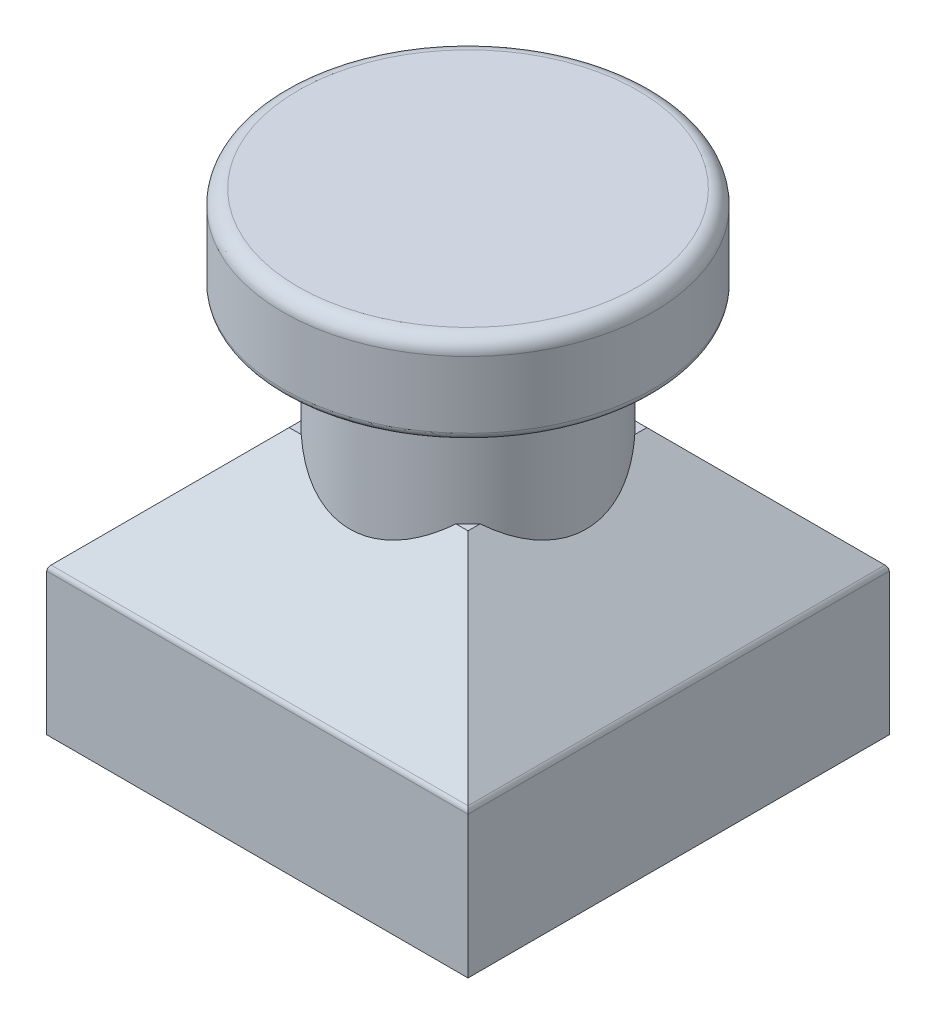
ISO-10303-21;
HEADER;
FILE_DESCRIPTION(('STEP AP214'),'2;1');
FILE_NAME('part.step','',(''),(''),'','','');
FILE_SCHEMA(('AUTOMOTIVE_DESIGN { 1 0 10303 214 1 1 1 1 }'));
ENDSEC;
DATA;
#1=APPLICATION_CONTEXT('core data for automotive mechanical design processes');
#2=APPLICATION_PROTOCOL_DEFINITION('international standard','automotive_design',2000,#1);
#3=PRODUCT_CONTEXT('',#1,'mechanical');
#4=PRODUCT('Part','Part','',(#3));
#5=PRODUCT_RELATED_PRODUCT_CATEGORY('part','',(#4));
#6=PRODUCT_DEFINITION_FORMATION('','',#4);
#7=PRODUCT_DEFINITION_CONTEXT('part definition',#1,'design');
#8=PRODUCT_DEFINITION('design','',#6,#7);
#9=PRODUCT_DEFINITION_SHAPE('','',#8);
#10=(LENGTH_UNIT() NAMED_UNIT(*) SI_UNIT(.MILLI.,.METRE.));
#11=(NAMED_UNIT(*) PLANE_ANGLE_UNIT() SI_UNIT($,.RADIAN.));
#12=(NAMED_UNIT(*) SI_UNIT($,.STERADIAN.) SOLID_ANGLE_UNIT());
#13=UNCERTAINTY_MEASURE_WITH_UNIT(LENGTH_MEASURE(1.E-05),#10,'distance_accuracy_value','');
#14=(GEOMETRIC_REPRESENTATION_CONTEXT(3) GLOBAL_UNCERTAINTY_ASSIGNED_CONTEXT((#13)) GLOBAL_UNIT_ASSIGNED_CONTEXT((#10,
#11,#12)) REPRESENTATION_CONTEXT('',''));
#15=CARTESIAN_POINT('',(0.,0.,0.));
#16=DIRECTION('',(0.,0.,1.));
#17=DIRECTION('',(1.,0.,0.));
#18=AXIS2_PLACEMENT_3D('',#15,#16,#17);
#19=CARTESIAN_POINT('',(0.,9.,0.));
#20=DIRECTION('',(0.,1.,0.));
#21=DIRECTION('',(0.,0.,1.));
#22=AXIS2_PLACEMENT_3D('',#19,#20,#21);
#23=PLANE('',#22);
#24=DIRECTION('',(-1.,0.,0.));
#25=VECTOR('',#24,1.);
#26=CARTESIAN_POINT('',(-7.125,9.,-3.02499999999993));
#27=LINE('',#26,#25);
#28=CARTESIAN_POINT('',(-2.61713106282441,9.,-3.02499999999993));
#29=VERTEX_POINT('',#28);
#30=CARTESIAN_POINT('',(-3.02499999999993,9.,-3.02499999999993));
#31=VERTEX_POINT('',#30);
#32=EDGE_CURVE('E198',#29,#31,#27,.T.);
#33=ORIENTED_EDGE('',*,*,#32,.T.);
#34=DIRECTION('',(0.,0.,1.));
#35=VECTOR('',#34,1.);
#36=CARTESIAN_POINT('',(-3.02499999999993,9.,7.125));
#37=LINE('',#36,#35);
#38=CARTESIAN_POINT('',(-3.02499999999993,9.,-2.61713106282441));
#39=VERTEX_POINT('',#38);
#40=EDGE_CURVE('E201',#31,#39,#37,.T.);
#41=ORIENTED_EDGE('',*,*,#40,.T.);
#42=CARTESIAN_POINT('',(0.,9.,0.));
#43=DIRECTION('',(0.,-1.,0.));
#44=DIRECTION('',(0.,0.,-1.));
#45=AXIS2_PLACEMENT_3D('',#42,#43,#44);
#46=CIRCLE('',#45,4.);
#47=EDGE_CURVE('E232',#39,#29,#46,.T.);
#48=ORIENTED_EDGE('',*,*,#47,.T.);
#49=EDGE_LOOP('',(#33,#41,#48));
#50=FACE_BOUND('',#49,.T.);
#51=ADVANCED_FACE('F39',(#50),#23,.T.);
#52=DIRECTION('',(0.,0.,-1.));
#53=VECTOR('',#52,1.);
#54=CARTESIAN_POINT('',(3.02499999999993,9.,-7.125));
#55=LINE('',#54,#53);
#56=CARTESIAN_POINT('',(3.02499999999993,9.,-2.61713106282441));
#57=VERTEX_POINT('',#56);
#58=CARTESIAN_POINT('',(3.02499999999993,9.,-3.02499999999993));
#59=VERTEX_POINT('',#58);
#60=EDGE_CURVE('E192',#57,#59,#55,.T.);
#61=ORIENTED_EDGE('',*,*,#60,.T.);
#62=DIRECTION('',(-1.,0.,0.));
#63=VECTOR('',#62,1.);
#64=CARTESIAN_POINT('',(-7.125,9.,-3.02499999999993));
#65=LINE('',#64,#63);
#66=CARTESIAN_POINT('',(2.61713106282441,9.,-3.02499999999993));
#67=VERTEX_POINT('',#66);
#68=EDGE_CURVE('E195',#59,#67,#65,.T.);
#69=ORIENTED_EDGE('',*,*,#68,.T.);
#70=EDGE_CURVE('E163',#67,#57,#46,.T.);
#71=ORIENTED_EDGE('',*,*,#70,.T.);
#72=EDGE_LOOP('',(#61,#69,#71));
#73=FACE_BOUND('',#72,.T.);
#74=ADVANCED_FACE('F292',(#73),#23,.T.);
#75=CARTESIAN_POINT('',(-2.61713106282441,9.,3.02499999999993));
#76=VERTEX_POINT('',#75);
#77=CARTESIAN_POINT('',(-3.02499999999993,9.,2.61713106282441));
#78=VERTEX_POINT('',#77);
#79=EDGE_CURVE('E321',#76,#78,#46,.T.);
#80=ORIENTED_EDGE('',*,*,#79,.T.);
#81=DIRECTION('',(0.,0.,1.));
#82=VECTOR('',#81,1.);
#83=CARTESIAN_POINT('',(-3.02499999999993,9.,7.125));
#84=LINE('',#83,#82);
#85=CARTESIAN_POINT('',(-3.02499999999993,9.,3.02499999999993));
#86=VERTEX_POINT('',#85);
#87=EDGE_CURVE('E188',#78,#86,#84,.T.);
#88=ORIENTED_EDGE('',*,*,#87,.T.);
#89=DIRECTION('',(1.,0.,0.));
#90=VECTOR('',#89,1.);
#91=CARTESIAN_POINT('',(7.125,9.,3.02499999999993));
#92=LINE('',#91,#90);
#93=EDGE_CURVE('E185',#86,#76,#92,.T.);
#94=ORIENTED_EDGE('',*,*,#93,.T.);
#95=EDGE_LOOP('',(#80,#88,#94));
#96=FACE_BOUND('',#95,.T.);
#97=ADVANCED_FACE('F299',(#96),#23,.T.);
#98=CARTESIAN_POINT('',(7.125,16.,-7.125));
#99=DIRECTION('',(-1.,0.,0.));
#100=DIRECTION('',(0.,0.,1.));
#101=AXIS2_PLACEMENT_3D('',#98,#99,#100);
#102=PLANE('',#101);
#103=DIRECTION('',(0.,-1.,0.));
#104=VECTOR('',#103,1.);
#105=CARTESIAN_POINT('',(7.125,16.,-7.125));
#106=LINE('',#105,#104);
#107=CARTESIAN_POINT('',(7.125,4.7964466094067,-7.125));
#108=VERTEX_POINT('',#107);
#109=CARTESIAN_POINT('',(7.125,0.,-7.125));
#110=VERTEX_POINT('',#109);
#111=EDGE_CURVE('E132',#108,#110,#106,.T.);
#112=ORIENTED_EDGE('',*,*,#111,.F.);
#113=DIRECTION('',(0.,0.,1.));
#114=VECTOR('',#113,1.);
#115=CARTESIAN_POINT('',(7.125,4.7964466094067,7.125));
#116=LINE('',#115,#114);
#117=CARTESIAN_POINT('',(7.125,4.7964466094067,7.125));
#118=VERTEX_POINT('',#117);
#119=EDGE_CURVE('E246',#108,#118,#116,.T.);
#120=ORIENTED_EDGE('',*,*,#119,.T.);
#121=DIRECTION('',(0.,-1.,0.));
#122=VECTOR('',#121,1.);
#123=CARTESIAN_POINT('',(7.125,16.,7.125));
#124=LINE('',#123,#122);
#125=CARTESIAN_POINT('',(7.125,0.,7.125));
#126=VERTEX_POINT('',#125);
#127=EDGE_CURVE('E156',#118,#126,#124,.T.);
#128=ORIENTED_EDGE('',*,*,#127,.T.);
#129=DIRECTION('',(0.,0.,-1.));
#130=VECTOR('',#129,1.);
#131=CARTESIAN_POINT('',(7.125,0.,-7.125));
#132=LINE('',#131,#130);
#133=EDGE_CURVE('E150',#126,#110,#132,.T.);
#134=ORIENTED_EDGE('',*,*,#133,.T.);
#135=EDGE_LOOP('',(#112,#120,#128,#134));
#136=FACE_BOUND('',#135,.T.);
#137=ADVANCED_FACE('F155',(#136),#102,.F.);
#138=CARTESIAN_POINT('',(-7.125,16.,-7.125));
#139=DIRECTION('',(0.,0.,1.));
#140=DIRECTION('',(1.,0.,0.));
#141=AXIS2_PLACEMENT_3D('',#138,#139,#140);
#142=PLANE('',#141);
#143=DIRECTION('',(0.,-1.,0.));
#144=VECTOR('',#143,1.);
#145=CARTESIAN_POINT('',(-7.125,16.,-7.125));
#146=LINE('',#145,#144);
#147=CARTESIAN_POINT('',(-7.125,4.7964466094067,-7.125));
#148=VERTEX_POINT('',#147);
#149=CARTESIAN_POINT('',(-7.125,0.,-7.125));
#150=VERTEX_POINT('',#149);
#151=EDGE_CURVE('E144',#148,#150,#146,.T.);
#152=ORIENTED_EDGE('',*,*,#151,.F.);
#153=DIRECTION('',(1.,0.,0.));
#154=VECTOR('',#153,1.);
#155=CARTESIAN_POINT('',(7.125,4.7964466094067,-7.125));
#156=LINE('',#155,#154);
#157=EDGE_CURVE('E139',#148,#108,#156,.T.);
#158=ORIENTED_EDGE('',*,*,#157,.T.);
#159=ORIENTED_EDGE('',*,*,#111,.T.);
#160=DIRECTION('',(-1.,0.,0.));
#161=VECTOR('',#160,1.);
#162=CARTESIAN_POINT('',(-7.125,0.,-7.125));
#163=LINE('',#162,#161);
#164=EDGE_CURVE('E136',#110,#150,#163,.T.);
#165=ORIENTED_EDGE('',*,*,#164,.T.);
#166=EDGE_LOOP('',(#152,#158,#159,#165));
#167=FACE_BOUND('',#166,.T.);
#168=ADVANCED_FACE('F135',(#167),#142,.F.);
#169=CARTESIAN_POINT('',(-7.125,16.,-7.125));
#170=DIRECTION('',(1.,0.,0.));
#171=DIRECTION('',(0.,0.,-1.));
#172=AXIS2_PLACEMENT_3D('',#169,#170,#171);
#173=PLANE('',#172);
#174=DIRECTION('',(0.,-1.,0.));
#175=VECTOR('',#174,1.);
#176=CARTESIAN_POINT('',(-7.125,16.,7.125));
#177=LINE('',#176,#175);
#178=CARTESIAN_POINT('',(-7.125,4.7964466094067,7.125));
#179=VERTEX_POINT('',#178);
#180=CARTESIAN_POINT('',(-7.125,0.,7.125));
#181=VERTEX_POINT('',#180);
#182=EDGE_CURVE('E174',#179,#181,#177,.T.);
#183=ORIENTED_EDGE('',*,*,#182,.F.);
#184=DIRECTION('',(0.,0.,-1.));
#185=VECTOR('',#184,1.);
#186=CARTESIAN_POINT('',(-7.125,4.7964466094067,-7.125));
#187=LINE('',#186,#185);
#188=EDGE_CURVE('E257',#179,#148,#187,.T.);
#189=ORIENTED_EDGE('',*,*,#188,.T.);
#190=ORIENTED_EDGE('',*,*,#151,.T.);
#191=DIRECTION('',(0.,0.,1.));
#192=VECTOR('',#191,1.);
#193=CARTESIAN_POINT('',(-7.125,0.,-7.125));
#194=LINE('',#193,#192);
#195=EDGE_CURVE('E152',#150,#181,#194,.T.);
#196=ORIENTED_EDGE('',*,*,#195,.T.);
#197=EDGE_LOOP('',(#183,#189,#190,#196));
#198=FACE_BOUND('',#197,.T.);
#199=ADVANCED_FACE('F344',(#198),#173,.F.);
#200=CARTESIAN_POINT('',(-7.125,16.,7.125));
#201=DIRECTION('',(0.,0.,-1.));
#202=DIRECTION('',(-1.,0.,0.));
#203=AXIS2_PLACEMENT_3D('',#200,#201,#202);
#204=PLANE('',#203);
#205=ORIENTED_EDGE('',*,*,#127,.F.);
#206=DIRECTION('',(-1.,0.,0.));
#207=VECTOR('',#206,1.);
#208=CARTESIAN_POINT('',(-7.125,4.7964466094067,7.125));
#209=LINE('',#208,#207);
#210=EDGE_CURVE('E63',#118,#179,#209,.T.);
#211=ORIENTED_EDGE('',*,*,#210,.T.);
#212=ORIENTED_EDGE('',*,*,#182,.T.);
#213=DIRECTION('',(1.,0.,0.));
#214=VECTOR('',#213,1.);
#215=CARTESIAN_POINT('',(-7.125,0.,7.125));
#216=LINE('',#215,#214);
#217=EDGE_CURVE('E169',#181,#126,#216,.T.);
#218=ORIENTED_EDGE('',*,*,#217,.T.);
#219=EDGE_LOOP('',(#205,#211,#212,#218));
#220=FACE_BOUND('',#219,.T.);
#221=ADVANCED_FACE('F311',(#220),#204,.F.);
#222=CARTESIAN_POINT('',(0.,0.,0.));
#223=DIRECTION('',(0.,1.,0.));
#224=DIRECTION('',(0.,0.,1.));
#225=AXIS2_PLACEMENT_3D('',#222,#223,#224);
#226=PLANE('',#225);
#227=ORIENTED_EDGE('',*,*,#133,.F.);
#228=ORIENTED_EDGE('',*,*,#217,.F.);
#229=ORIENTED_EDGE('',*,*,#195,.F.);
#230=ORIENTED_EDGE('',*,*,#164,.F.);
#231=EDGE_LOOP('',(#227,#228,#229,#230));
#232=FACE_BOUND('',#231,.T.);
#233=ADVANCED_FACE('F148',(#232),#226,.F.);
#234=DIRECTION('',(1.,0.,0.));
#235=VECTOR('',#234,1.);
#236=CARTESIAN_POINT('',(7.125,9.,3.02499999999993));
#237=LINE('',#236,#235);
#238=CARTESIAN_POINT('',(2.61713106282441,9.,3.02499999999993));
#239=VERTEX_POINT('',#238);
#240=CARTESIAN_POINT('',(3.02499999999993,9.,3.02499999999993));
#241=VERTEX_POINT('',#240);
#242=EDGE_CURVE('E143',#239,#241,#237,.T.);
#243=ORIENTED_EDGE('',*,*,#242,.T.);
#244=DIRECTION('',(0.,0.,-1.));
#245=VECTOR('',#244,1.);
#246=CARTESIAN_POINT('',(3.02499999999993,9.,-7.125));
#247=LINE('',#246,#245);
#248=CARTESIAN_POINT('',(3.02499999999993,9.,2.61713106282441));
#249=VERTEX_POINT('',#248);
#250=EDGE_CURVE('E182',#241,#249,#247,.T.);
#251=ORIENTED_EDGE('',*,*,#250,.T.);
#252=EDGE_CURVE('E327',#249,#239,#46,.T.);
#253=ORIENTED_EDGE('',*,*,#252,.T.);
#254=EDGE_LOOP('',(#243,#251,#253));
#255=FACE_BOUND('',#254,.T.);
#256=ADVANCED_FACE('F295',(#255),#23,.T.);
#257=CARTESIAN_POINT('',(0.,0.,0.));
#258=DIRECTION('',(0.,-1.,0.));
#259=DIRECTION('',(0.,0.,-1.));
#260=AXIS2_PLACEMENT_3D('',#257,#258,#259);
#261=CYLINDRICAL_SURFACE('',#260,6.25);
#262=CARTESIAN_POINT('',(0.,13.25,0.));
#263=DIRECTION('',(0.,-1.,0.));
#264=DIRECTION('',(0.,0.,-1.));
#265=AXIS2_PLACEMENT_3D('',#262,#263,#264);
#266=CIRCLE('',#265,6.25);
#267=CARTESIAN_POINT('',(0.,13.25,-6.25));
#268=VERTEX_POINT('',#267);
#269=EDGE_CURVE('E11',#268,#268,#266,.F.);
#270=ORIENTED_EDGE('',*,*,#269,.T.);
#271=EDGE_LOOP('',(#270));
#272=FACE_BOUND('',#271,.T.);
#273=CARTESIAN_POINT('',(0.,15.5,0.));
#274=DIRECTION('',(0.,1.,0.));
#275=DIRECTION('',(0.,0.,1.));
#276=AXIS2_PLACEMENT_3D('',#273,#274,#275);
#277=CIRCLE('',#276,6.25);
#278=CARTESIAN_POINT('',(0.,15.5,6.25));
#279=VERTEX_POINT('',#278);
#280=EDGE_CURVE('E217',#279,#279,#277,.F.);
#281=ORIENTED_EDGE('',*,*,#280,.T.);
#282=EDGE_LOOP('',(#281));
#283=FACE_BOUND('',#282,.T.);
#284=ADVANCED_FACE('F303',(#272,#283),#261,.T.);
#285=CARTESIAN_POINT('',(0.,13.,0.));
#286=DIRECTION('',(0.,-1.,0.));
#287=DIRECTION('',(0.,0.,-1.));
#288=AXIS2_PLACEMENT_3D('',#285,#286,#287);
#289=PLANE('',#288);
#290=CARTESIAN_POINT('',(0.,13.,0.));
#291=DIRECTION('',(0.,-1.,0.));
#292=DIRECTION('',(0.,0.,-1.));
#293=AXIS2_PLACEMENT_3D('',#290,#291,#292);
#294=CIRCLE('',#293,6.);
#295=CARTESIAN_POINT('',(0.,13.,-6.));
#296=VERTEX_POINT('',#295);
#297=EDGE_CURVE('E48',#296,#296,#294,.T.);
#298=ORIENTED_EDGE('',*,*,#297,.T.);
#299=EDGE_LOOP('',(#298));
#300=FACE_BOUND('',#299,.T.);
#301=CARTESIAN_POINT('',(0.,13.,0.));
#302=DIRECTION('',(0.,-1.,0.));
#303=DIRECTION('',(0.,0.,-1.));
#304=AXIS2_PLACEMENT_3D('',#301,#302,#303);
#305=CIRCLE('',#304,4.);
#306=CARTESIAN_POINT('',(0.,13.,-4.));
#307=VERTEX_POINT('',#306);
#308=EDGE_CURVE('E159',#307,#307,#305,.T.);
#309=ORIENTED_EDGE('',*,*,#308,.F.);
#310=EDGE_LOOP('',(#309));
#311=FACE_BOUND('',#310,.T.);
#312=ADVANCED_FACE('F278',(#300,#311),#289,.T.);
#313=CARTESIAN_POINT('',(0.,0.,0.));
#314=DIRECTION('',(0.,-1.,0.));
#315=DIRECTION('',(0.,0.,-1.));
#316=AXIS2_PLACEMENT_3D('',#313,#314,#315);
#317=CYLINDRICAL_SURFACE('',#316,4.);
#318=ORIENTED_EDGE('',*,*,#308,.T.);
#319=EDGE_LOOP('',(#318));
#320=FACE_BOUND('',#319,.T.);
#321=ORIENTED_EDGE('',*,*,#70,.F.);
#322=CARTESIAN_POINT('',(0.,12.0249999999999,0.));
#323=DIRECTION('',(0.,0.707106781186551,-0.707106781186544));
#324=DIRECTION('',(0.,-0.707106781186544,-0.707106781186551));
#325=AXIS2_PLACEMENT_3D('',#322,#323,#324);
#326=ELLIPSE('',#325,5.65685424949235,4.);
#327=EDGE_CURVE('E208',#67,#29,#326,.T.);
#328=ORIENTED_EDGE('',*,*,#327,.T.);
#329=ORIENTED_EDGE('',*,*,#47,.F.);
#330=CARTESIAN_POINT('',(0.,12.0249999999999,0.));
#331=DIRECTION('',(-0.707106781186544,0.707106781186551,0.));
#332=DIRECTION('',(-0.707106781186551,-0.707106781186544,0.));
#333=AXIS2_PLACEMENT_3D('',#330,#331,#332);
#334=ELLIPSE('',#333,5.65685424949235,4.);
#335=EDGE_CURVE('E205',#39,#78,#334,.T.);
#336=ORIENTED_EDGE('',*,*,#335,.T.);
#337=ORIENTED_EDGE('',*,*,#79,.F.);
#338=CARTESIAN_POINT('',(0.,12.0249999999999,0.));
#339=DIRECTION('',(0.,0.707106781186551,0.707106781186544));
#340=DIRECTION('',(0.,-0.707106781186544,0.707106781186551));
#341=AXIS2_PLACEMENT_3D('',#338,#339,#340);
#342=ELLIPSE('',#341,5.65685424949235,4.);
#343=EDGE_CURVE('E214',#76,#239,#342,.T.);
#344=ORIENTED_EDGE('',*,*,#343,.T.);
#345=ORIENTED_EDGE('',*,*,#252,.F.);
#346=CARTESIAN_POINT('',(0.,12.0249999999999,0.));
#347=DIRECTION('',(0.707106781186544,0.707106781186551,0.));
#348=DIRECTION('',(0.707106781186551,-0.707106781186544,0.));
#349=AXIS2_PLACEMENT_3D('',#346,#347,#348);
#350=ELLIPSE('',#349,5.65685424949235,4.);
#351=EDGE_CURVE('E211',#249,#57,#350,.T.);
#352=ORIENTED_EDGE('',*,*,#351,.T.);
#353=EDGE_LOOP('',(#321,#328,#329,#336,#337,#344,#345,#352));
#354=FACE_BOUND('',#353,.T.);
#355=ADVANCED_FACE('F362',(#320,#354),#317,.T.);
#356=CARTESIAN_POINT('',(0.,16.,0.));
#357=DIRECTION('',(0.,1.,0.));
#358=DIRECTION('',(0.,0.,1.));
#359=AXIS2_PLACEMENT_3D('',#356,#357,#358);
#360=PLANE('',#359);
#361=CARTESIAN_POINT('',(0.,16.,0.));
#362=DIRECTION('',(0.,1.,0.));
#363=DIRECTION('',(0.,0.,1.));
#364=AXIS2_PLACEMENT_3D('',#361,#362,#363);
#365=CIRCLE('',#364,5.75);
#366=CARTESIAN_POINT('',(0.,16.,5.75));
#367=VERTEX_POINT('',#366);
#368=EDGE_CURVE('E236',#367,#367,#365,.T.);
#369=ORIENTED_EDGE('',*,*,#368,.T.);
#370=EDGE_LOOP('',(#369));
#371=FACE_BOUND('',#370,.T.);
#372=ADVANCED_FACE('F373',(#371),#360,.T.);
#373=CARTESIAN_POINT('',(3.02499999999993,9.,0.));
#374=DIRECTION('',(0.707106781186544,0.707106781186551,0.));
#375=DIRECTION('',(0.,0.,1.));
#376=AXIS2_PLACEMENT_3D('',#373,#374,#375);
#377=PLANE('',#376);
#378=DIRECTION('',(-0.577350269189628,0.577350269189622,-0.577350269189628));
#379=VECTOR('',#378,1.);
#380=CARTESIAN_POINT('',(2.01666666666661,10.0083333333333,2.01666666666661));
#381=LINE('',#380,#379);
#382=CARTESIAN_POINT('',(7.05177669529663,4.97322330470334,7.05177669529663));
#383=VERTEX_POINT('',#382);
#384=EDGE_CURVE('E225',#383,#241,#381,.T.);
#385=ORIENTED_EDGE('',*,*,#384,.F.);
#386=DIRECTION('',(0.,0.,1.));
#387=VECTOR('',#386,1.);
#388=CARTESIAN_POINT('',(7.05177669529664,4.97322330470334,-7.125));
#389=LINE('',#388,#387);
#390=CARTESIAN_POINT('',(7.05177669529663,4.97322330470334,-7.05177669529663));
#391=VERTEX_POINT('',#390);
#392=EDGE_CURVE('E249',#383,#391,#389,.F.);
#393=ORIENTED_EDGE('',*,*,#392,.T.);
#394=DIRECTION('',(-0.577350269189628,0.577350269189622,0.577350269189628));
#395=VECTOR('',#394,1.);
#396=CARTESIAN_POINT('',(2.01666666666661,10.0083333333333,-2.01666666666661));
#397=LINE('',#396,#395);
#398=EDGE_CURVE('E228',#59,#391,#397,.F.);
#399=ORIENTED_EDGE('',*,*,#398,.F.);
#400=ORIENTED_EDGE('',*,*,#60,.F.);
#401=ORIENTED_EDGE('',*,*,#351,.F.);
#402=ORIENTED_EDGE('',*,*,#250,.F.);
#403=EDGE_LOOP('',(#385,#393,#399,#400,#401,#402));
#404=FACE_BOUND('',#403,.T.);
#405=ADVANCED_FACE('F350',(#404),#377,.T.);
#406=CARTESIAN_POINT('',(0.,9.,-3.02499999999993));
#407=DIRECTION('',(0.,0.707106781186551,-0.707106781186544));
#408=DIRECTION('',(1.,0.,0.));
#409=AXIS2_PLACEMENT_3D('',#406,#407,#408);
#410=PLANE('',#409);
#411=ORIENTED_EDGE('',*,*,#398,.T.);
#412=DIRECTION('',(1.,0.,0.));
#413=VECTOR('',#412,1.);
#414=CARTESIAN_POINT('',(-7.125,4.97322330470334,-7.05177669529664));
#415=LINE('',#414,#413);
#416=CARTESIAN_POINT('',(-7.05177669529663,4.97322330470334,-7.05177669529663));
#417=VERTEX_POINT('',#416);
#418=EDGE_CURVE('E242',#391,#417,#415,.F.);
#419=ORIENTED_EDGE('',*,*,#418,.T.);
#420=DIRECTION('',(0.577350269189628,0.577350269189622,0.577350269189628));
#421=VECTOR('',#420,1.);
#422=CARTESIAN_POINT('',(-2.01666666666661,10.0083333333333,-2.01666666666661));
#423=LINE('',#422,#421);
#424=EDGE_CURVE('E221',#31,#417,#423,.F.);
#425=ORIENTED_EDGE('',*,*,#424,.F.);
#426=ORIENTED_EDGE('',*,*,#32,.F.);
#427=ORIENTED_EDGE('',*,*,#327,.F.);
#428=ORIENTED_EDGE('',*,*,#68,.F.);
#429=EDGE_LOOP('',(#411,#419,#425,#426,#427,#428));
#430=FACE_BOUND('',#429,.T.);
#431=ADVANCED_FACE('F356',(#430),#410,.T.);
#432=CARTESIAN_POINT('',(0.,9.,3.02499999999993));
#433=DIRECTION('',(0.,0.707106781186551,0.707106781186544));
#434=DIRECTION('',(-1.,0.,0.));
#435=AXIS2_PLACEMENT_3D('',#432,#433,#434);
#436=PLANE('',#435);
#437=DIRECTION('',(-0.577350269189628,-0.577350269189622,0.577350269189628));
#438=VECTOR('',#437,1.);
#439=CARTESIAN_POINT('',(-2.01666666666661,10.0083333333333,2.01666666666661));
#440=LINE('',#439,#438);
#441=CARTESIAN_POINT('',(-7.05177669529664,4.97322330470334,7.05177669529663));
#442=VERTEX_POINT('',#441);
#443=EDGE_CURVE('E218',#442,#86,#440,.F.);
#444=ORIENTED_EDGE('',*,*,#443,.F.);
#445=DIRECTION('',(-1.,0.,0.));
#446=VECTOR('',#445,1.);
#447=CARTESIAN_POINT('',(7.125,4.97322330470334,7.05177669529664));
#448=LINE('',#447,#446);
#449=EDGE_CURVE('E254',#442,#383,#448,.F.);
#450=ORIENTED_EDGE('',*,*,#449,.T.);
#451=ORIENTED_EDGE('',*,*,#384,.T.);
#452=ORIENTED_EDGE('',*,*,#242,.F.);
#453=ORIENTED_EDGE('',*,*,#343,.F.);
#454=ORIENTED_EDGE('',*,*,#93,.F.);
#455=EDGE_LOOP('',(#444,#450,#451,#452,#453,#454));
#456=FACE_BOUND('',#455,.T.);
#457=ADVANCED_FACE('F332',(#456),#436,.T.);
#458=CARTESIAN_POINT('',(-3.02499999999993,9.,0.));
#459=DIRECTION('',(-0.707106781186544,0.707106781186551,0.));
#460=DIRECTION('',(0.,0.,-1.));
#461=AXIS2_PLACEMENT_3D('',#458,#459,#460);
#462=PLANE('',#461);
#463=ORIENTED_EDGE('',*,*,#424,.T.);
#464=DIRECTION('',(0.,0.,-1.));
#465=VECTOR('',#464,1.);
#466=CARTESIAN_POINT('',(-7.05177669529664,4.97322330470334,7.125));
#467=LINE('',#466,#465);
#468=EDGE_CURVE('E55',#417,#442,#467,.F.);
#469=ORIENTED_EDGE('',*,*,#468,.T.);
#470=ORIENTED_EDGE('',*,*,#443,.T.);
#471=ORIENTED_EDGE('',*,*,#87,.F.);
#472=ORIENTED_EDGE('',*,*,#335,.F.);
#473=ORIENTED_EDGE('',*,*,#40,.F.);
#474=EDGE_LOOP('',(#463,#469,#470,#471,#472,#473));
#475=FACE_BOUND('',#474,.T.);
#476=ADVANCED_FACE('F328',(#475),#462,.T.);
#477=CARTESIAN_POINT('',(0.,15.5,0.));
#478=DIRECTION('',(0.,1.,0.));
#479=DIRECTION('',(0.,0.,1.));
#480=AXIS2_PLACEMENT_3D('',#477,#478,#479);
#481=TOROIDAL_SURFACE('',#480,5.75,0.5);
#482=ORIENTED_EDGE('',*,*,#368,.F.);
#483=EDGE_LOOP('',(#482));
#484=FACE_BOUND('',#483,.T.);
#485=ORIENTED_EDGE('',*,*,#280,.F.);
#486=EDGE_LOOP('',(#485));
#487=FACE_BOUND('',#486,.T.);
#488=ADVANCED_FACE('F391',(#484,#487),#481,.T.);
#489=CARTESIAN_POINT('',(-7.125,4.7964466094067,6.875));
#490=DIRECTION('',(1.,0.,0.));
#491=DIRECTION('',(0.,0.,-1.));
#492=AXIS2_PLACEMENT_3D('',#489,#490,#491);
#493=CYLINDRICAL_SURFACE('',#492,0.25);
#494=CARTESIAN_POINT('',(6.875,4.7964466094067,6.875));
#495=DIRECTION('',(0.707106781186547,0.,-0.707106781186547));
#496=DIRECTION('',(0.707106781186547,0.,0.707106781186547));
#497=AXIS2_PLACEMENT_3D('',#494,#495,#496);
#498=ELLIPSE('',#497,0.353553390593274,0.25);
#499=EDGE_CURVE('E268',#383,#118,#498,.T.);
#500=ORIENTED_EDGE('',*,*,#499,.F.);
#501=ORIENTED_EDGE('',*,*,#449,.F.);
#502=CARTESIAN_POINT('',(-6.875,4.7964466094067,6.875));
#503=DIRECTION('',(0.707106781186547,0.,0.707106781186547));
#504=DIRECTION('',(-0.707106781186547,0.,0.707106781186547));
#505=AXIS2_PLACEMENT_3D('',#502,#503,#504);
#506=ELLIPSE('',#505,0.353553390593274,0.25);
#507=EDGE_CURVE('E222',#179,#442,#506,.F.);
#508=ORIENTED_EDGE('',*,*,#507,.F.);
#509=ORIENTED_EDGE('',*,*,#210,.F.);
#510=EDGE_LOOP('',(#500,#501,#508,#509));
#511=FACE_BOUND('',#510,.T.);
#512=ADVANCED_FACE('F337',(#511),#493,.T.);
#513=CARTESIAN_POINT('',(-6.875,4.7964466094067,-7.125));
#514=DIRECTION('',(0.,0.,1.));
#515=DIRECTION('',(1.,0.,0.));
#516=AXIS2_PLACEMENT_3D('',#513,#514,#515);
#517=CYLINDRICAL_SURFACE('',#516,0.25);
#518=ORIENTED_EDGE('',*,*,#507,.T.);
#519=ORIENTED_EDGE('',*,*,#468,.F.);
#520=CARTESIAN_POINT('',(-6.875,4.7964466094067,-6.875));
#521=DIRECTION('',(-0.707106781186547,0.,0.707106781186547));
#522=DIRECTION('',(0.707106781186547,0.,0.707106781186547));
#523=AXIS2_PLACEMENT_3D('',#520,#521,#522);
#524=ELLIPSE('',#523,0.353553390593274,0.25);
#525=EDGE_CURVE('E265',#148,#417,#524,.F.);
#526=ORIENTED_EDGE('',*,*,#525,.F.);
#527=ORIENTED_EDGE('',*,*,#188,.F.);
#528=EDGE_LOOP('',(#518,#519,#526,#527));
#529=FACE_BOUND('',#528,.T.);
#530=ADVANCED_FACE('F341',(#529),#517,.T.);
#531=CARTESIAN_POINT('',(6.875,4.7964466094067,-7.125));
#532=DIRECTION('',(0.,0.,-1.));
#533=DIRECTION('',(-1.,0.,0.));
#534=AXIS2_PLACEMENT_3D('',#531,#532,#533);
#535=CYLINDRICAL_SURFACE('',#534,0.25);
#536=ORIENTED_EDGE('',*,*,#499,.T.);
#537=ORIENTED_EDGE('',*,*,#119,.F.);
#538=CARTESIAN_POINT('',(6.875,4.7964466094067,-6.875));
#539=DIRECTION('',(-0.707106781186547,0.,-0.707106781186547));
#540=DIRECTION('',(0.707106781186547,0.,-0.707106781186547));
#541=AXIS2_PLACEMENT_3D('',#538,#539,#540);
#542=ELLIPSE('',#541,0.353553390593274,0.25);
#543=EDGE_CURVE('E262',#391,#108,#542,.T.);
#544=ORIENTED_EDGE('',*,*,#543,.F.);
#545=ORIENTED_EDGE('',*,*,#392,.F.);
#546=EDGE_LOOP('',(#536,#537,#544,#545));
#547=FACE_BOUND('',#546,.T.);
#548=ADVANCED_FACE('F287',(#547),#535,.T.);
#549=CARTESIAN_POINT('',(-7.125,4.7964466094067,-6.875));
#550=DIRECTION('',(-1.,0.,0.));
#551=DIRECTION('',(0.,0.,1.));
#552=AXIS2_PLACEMENT_3D('',#549,#550,#551);
#553=CYLINDRICAL_SURFACE('',#552,0.25);
#554=ORIENTED_EDGE('',*,*,#525,.T.);
#555=ORIENTED_EDGE('',*,*,#418,.F.);
#556=ORIENTED_EDGE('',*,*,#543,.T.);
#557=ORIENTED_EDGE('',*,*,#157,.F.);
#558=EDGE_LOOP('',(#554,#555,#556,#557));
#559=FACE_BOUND('',#558,.T.);
#560=ADVANCED_FACE('F282',(#559),#553,.T.);
#561=CARTESIAN_POINT('',(0.,13.25,0.));
#562=DIRECTION('',(0.,-1.,0.));
#563=DIRECTION('',(0.,0.,-1.));
#564=AXIS2_PLACEMENT_3D('',#561,#562,#563);
#565=TOROIDAL_SURFACE('',#564,6.,0.25);
#566=ORIENTED_EDGE('',*,*,#269,.F.);
#567=EDGE_LOOP('',(#566));
#568=FACE_BOUND('',#567,.T.);
#569=ORIENTED_EDGE('',*,*,#297,.F.);
#570=EDGE_LOOP('',(#569));
#571=FACE_BOUND('',#570,.T.);
#572=ADVANCED_FACE('F41',(#568,#571),#565,.T.);
#573=CLOSED_SHELL('',(#51,#74,#97,#137,#168,#199,#221,#233,#256,#284,#312,#355,#372,#405,#431,
#457,#476,#488,#512,#530,#548,#560,#572));
#574=MANIFOLD_SOLID_BREP('B2',#573);
#575=ADVANCED_BREP_SHAPE_REPRESENTATION('',(#18,#574),#14);
#576=SHAPE_DEFINITION_REPRESENTATION(#9,#575);
ENDSEC;
END-ISO-10303-21;
